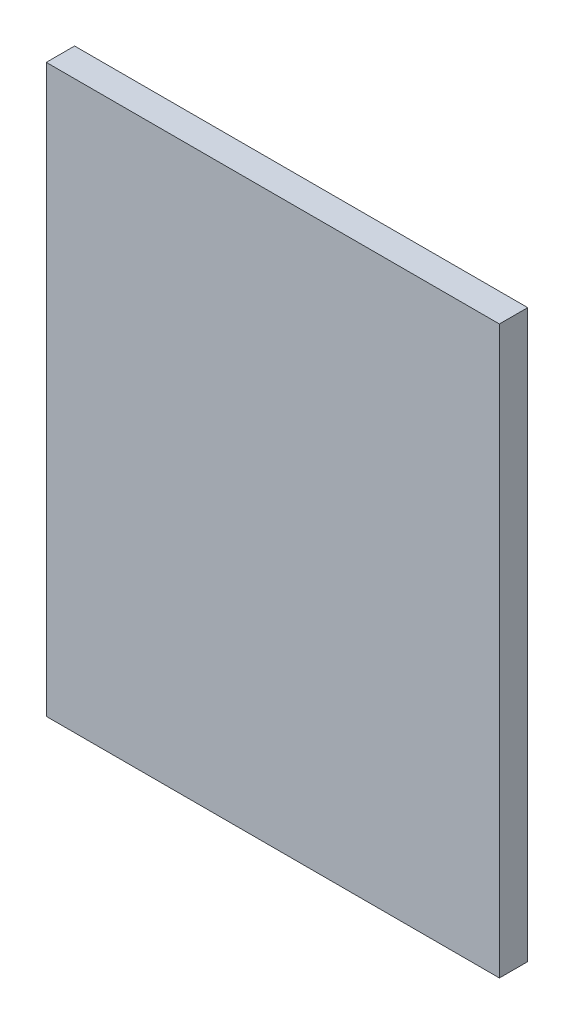
ISO-10303-21;
HEADER;
FILE_DESCRIPTION(('STEP AP214'),'2;1');
FILE_NAME('part.step','',(''),(''),'','','');
FILE_SCHEMA(('AUTOMOTIVE_DESIGN { 1 0 10303 214 1 1 1 1 }'));
ENDSEC;
DATA;
#1=APPLICATION_CONTEXT('core data for automotive mechanical design processes');
#2=APPLICATION_PROTOCOL_DEFINITION('international standard','automotive_design',2000,#1);
#3=PRODUCT_CONTEXT('',#1,'mechanical');
#4=PRODUCT('Part','Part','',(#3));
#5=PRODUCT_RELATED_PRODUCT_CATEGORY('part','',(#4));
#6=PRODUCT_DEFINITION_FORMATION('','',#4);
#7=PRODUCT_DEFINITION_CONTEXT('part definition',#1,'design');
#8=PRODUCT_DEFINITION('design','',#6,#7);
#9=PRODUCT_DEFINITION_SHAPE('','',#8);
#10=(LENGTH_UNIT() NAMED_UNIT(*) SI_UNIT(.MILLI.,.METRE.));
#11=(NAMED_UNIT(*) PLANE_ANGLE_UNIT() SI_UNIT($,.RADIAN.));
#12=(NAMED_UNIT(*) SI_UNIT($,.STERADIAN.) SOLID_ANGLE_UNIT());
#13=UNCERTAINTY_MEASURE_WITH_UNIT(LENGTH_MEASURE(1.E-05),#10,'distance_accuracy_value','');
#14=(GEOMETRIC_REPRESENTATION_CONTEXT(3) GLOBAL_UNCERTAINTY_ASSIGNED_CONTEXT((#13)) GLOBAL_UNIT_ASSIGNED_CONTEXT((#10,
#11,#12)) REPRESENTATION_CONTEXT('',''));
#15=CARTESIAN_POINT('',(0.,0.,0.));
#16=DIRECTION('',(0.,0.,1.));
#17=DIRECTION('',(1.,0.,0.));
#18=AXIS2_PLACEMENT_3D('',#15,#16,#17);
#19=CARTESIAN_POINT('',(0.,0.,0.1));
#20=DIRECTION('',(-1.,0.,0.));
#21=DIRECTION('',(0.,0.,1.));
#22=AXIS2_PLACEMENT_3D('',#19,#20,#21);
#23=PLANE('',#22);
#24=DIRECTION('',(0.,1.,0.));
#25=VECTOR('',#24,1.);
#26=CARTESIAN_POINT('',(0.,0.,0.));
#27=LINE('',#26,#25);
#28=CARTESIAN_POINT('',(0.,0.,0.));
#29=VERTEX_POINT('',#28);
#30=CARTESIAN_POINT('',(0.,2.,0.));
#31=VERTEX_POINT('',#30);
#32=EDGE_CURVE('E96',#29,#31,#27,.T.);
#33=ORIENTED_EDGE('',*,*,#32,.T.);
#34=DIRECTION('',(0.,0.,-1.));
#35=VECTOR('',#34,1.);
#36=CARTESIAN_POINT('',(0.,2.,0.1));
#37=LINE('',#36,#35);
#38=CARTESIAN_POINT('',(0.,2.,0.1));
#39=VERTEX_POINT('',#38);
#40=EDGE_CURVE('E11',#39,#31,#37,.T.);
#41=ORIENTED_EDGE('',*,*,#40,.F.);
#42=DIRECTION('',(0.,1.,0.));
#43=VECTOR('',#42,1.);
#44=CARTESIAN_POINT('',(0.,0.,0.1));
#45=LINE('',#44,#43);
#46=CARTESIAN_POINT('',(0.,0.,0.1));
#47=VERTEX_POINT('',#46);
#48=EDGE_CURVE('E84',#47,#39,#45,.T.);
#49=ORIENTED_EDGE('',*,*,#48,.F.);
#50=DIRECTION('',(0.,0.,-1.));
#51=VECTOR('',#50,1.);
#52=CARTESIAN_POINT('',(0.,0.,0.1));
#53=LINE('',#52,#51);
#54=EDGE_CURVE('E92',#47,#29,#53,.T.);
#55=ORIENTED_EDGE('',*,*,#54,.T.);
#56=EDGE_LOOP('',(#33,#41,#49,#55));
#57=FACE_BOUND('',#56,.T.);
#58=ADVANCED_FACE('F33',(#57),#23,.F.);
#59=CARTESIAN_POINT('',(0.,2.,0.1));
#60=DIRECTION('',(0.,-1.,0.));
#61=DIRECTION('',(0.,0.,-1.));
#62=AXIS2_PLACEMENT_3D('',#59,#60,#61);
#63=PLANE('',#62);
#64=DIRECTION('',(-1.,0.,0.));
#65=VECTOR('',#64,1.);
#66=CARTESIAN_POINT('',(0.,2.,0.));
#67=LINE('',#66,#65);
#68=CARTESIAN_POINT('',(-1.6,2.,0.));
#69=VERTEX_POINT('',#68);
#70=EDGE_CURVE('E88',#31,#69,#67,.T.);
#71=ORIENTED_EDGE('',*,*,#70,.T.);
#72=DIRECTION('',(0.,0.,-1.));
#73=VECTOR('',#72,1.);
#74=CARTESIAN_POINT('',(-1.6,2.,0.1));
#75=LINE('',#74,#73);
#76=CARTESIAN_POINT('',(-1.6,2.,0.1));
#77=VERTEX_POINT('',#76);
#78=EDGE_CURVE('E41',#77,#69,#75,.T.);
#79=ORIENTED_EDGE('',*,*,#78,.F.);
#80=DIRECTION('',(-1.,0.,0.));
#81=VECTOR('',#80,1.);
#82=CARTESIAN_POINT('',(0.,2.,0.1));
#83=LINE('',#82,#81);
#84=EDGE_CURVE('E79',#39,#77,#83,.T.);
#85=ORIENTED_EDGE('',*,*,#84,.F.);
#86=ORIENTED_EDGE('',*,*,#40,.T.);
#87=EDGE_LOOP('',(#71,#79,#85,#86));
#88=FACE_BOUND('',#87,.T.);
#89=ADVANCED_FACE('F87',(#88),#63,.F.);
#90=CARTESIAN_POINT('',(-1.6,0.,0.1));
#91=DIRECTION('',(1.,0.,0.));
#92=DIRECTION('',(0.,0.,-1.));
#93=AXIS2_PLACEMENT_3D('',#90,#91,#92);
#94=PLANE('',#93);
#95=DIRECTION('',(0.,-1.,0.));
#96=VECTOR('',#95,1.);
#97=CARTESIAN_POINT('',(-1.6,0.,0.));
#98=LINE('',#97,#96);
#99=CARTESIAN_POINT('',(-1.6,0.,0.));
#100=VERTEX_POINT('',#99);
#101=EDGE_CURVE('E66',#69,#100,#98,.T.);
#102=ORIENTED_EDGE('',*,*,#101,.T.);
#103=DIRECTION('',(0.,0.,-1.));
#104=VECTOR('',#103,1.);
#105=CARTESIAN_POINT('',(-1.6,0.,0.1));
#106=LINE('',#105,#104);
#107=CARTESIAN_POINT('',(-1.6,0.,0.1));
#108=VERTEX_POINT('',#107);
#109=EDGE_CURVE('E89',#108,#100,#106,.T.);
#110=ORIENTED_EDGE('',*,*,#109,.F.);
#111=DIRECTION('',(0.,-1.,0.));
#112=VECTOR('',#111,1.);
#113=CARTESIAN_POINT('',(-1.6,0.,0.1));
#114=LINE('',#113,#112);
#115=EDGE_CURVE('E82',#77,#108,#114,.T.);
#116=ORIENTED_EDGE('',*,*,#115,.F.);
#117=ORIENTED_EDGE('',*,*,#78,.T.);
#118=EDGE_LOOP('',(#102,#110,#116,#117));
#119=FACE_BOUND('',#118,.T.);
#120=ADVANCED_FACE('F90',(#119),#94,.F.);
#121=CARTESIAN_POINT('',(0.,0.,0.1));
#122=DIRECTION('',(0.,1.,0.));
#123=DIRECTION('',(0.,0.,1.));
#124=AXIS2_PLACEMENT_3D('',#121,#122,#123);
#125=PLANE('',#124);
#126=DIRECTION('',(1.,0.,0.));
#127=VECTOR('',#126,1.);
#128=CARTESIAN_POINT('',(0.,0.,0.));
#129=LINE('',#128,#127);
#130=EDGE_CURVE('E72',#100,#29,#129,.T.);
#131=ORIENTED_EDGE('',*,*,#130,.T.);
#132=ORIENTED_EDGE('',*,*,#54,.F.);
#133=DIRECTION('',(1.,0.,0.));
#134=VECTOR('',#133,1.);
#135=CARTESIAN_POINT('',(0.,0.,0.1));
#136=LINE('',#135,#134);
#137=EDGE_CURVE('E49',#108,#47,#136,.T.);
#138=ORIENTED_EDGE('',*,*,#137,.F.);
#139=ORIENTED_EDGE('',*,*,#109,.T.);
#140=EDGE_LOOP('',(#131,#132,#138,#139));
#141=FACE_BOUND('',#140,.T.);
#142=ADVANCED_FACE('F103',(#141),#125,.F.);
#143=CARTESIAN_POINT('',(0.,0.,0.1));
#144=DIRECTION('',(0.,0.,1.));
#145=DIRECTION('',(1.,0.,0.));
#146=AXIS2_PLACEMENT_3D('',#143,#144,#145);
#147=PLANE('',#146);
#148=ORIENTED_EDGE('',*,*,#48,.T.);
#149=ORIENTED_EDGE('',*,*,#84,.T.);
#150=ORIENTED_EDGE('',*,*,#115,.T.);
#151=ORIENTED_EDGE('',*,*,#137,.T.);
#152=EDGE_LOOP('',(#148,#149,#150,#151));
#153=FACE_BOUND('',#152,.T.);
#154=ADVANCED_FACE('F80',(#153),#147,.T.);
#155=CARTESIAN_POINT('',(0.,0.,0.));
#156=DIRECTION('',(0.,0.,1.));
#157=DIRECTION('',(1.,0.,0.));
#158=AXIS2_PLACEMENT_3D('',#155,#156,#157);
#159=PLANE('',#158);
#160=ORIENTED_EDGE('',*,*,#32,.F.);
#161=ORIENTED_EDGE('',*,*,#130,.F.);
#162=ORIENTED_EDGE('',*,*,#101,.F.);
#163=ORIENTED_EDGE('',*,*,#70,.F.);
#164=EDGE_LOOP('',(#160,#161,#162,#163));
#165=FACE_BOUND('',#164,.T.);
#166=ADVANCED_FACE('F106',(#165),#159,.F.);
#167=CLOSED_SHELL('',(#58,#89,#120,#142,#154,#166));
#168=MANIFOLD_SOLID_BREP('B2',#167);
#169=ADVANCED_BREP_SHAPE_REPRESENTATION('',(#18,#168),#14);
#170=SHAPE_DEFINITION_REPRESENTATION(#9,#169);
ENDSEC;
END-ISO-10303-21;
